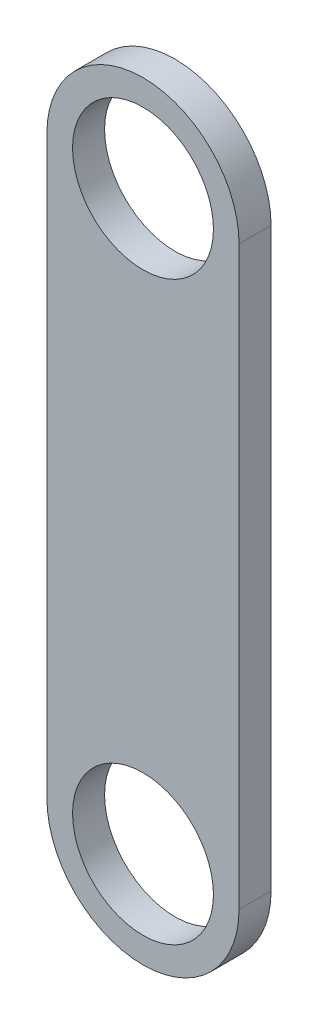
ISO-10303-21;
HEADER;
FILE_DESCRIPTION(('STEP AP214'),'2;1');
FILE_NAME('part.step','',(''),(''),'','','');
FILE_SCHEMA(('AUTOMOTIVE_DESIGN { 1 0 10303 214 1 1 1 1 }'));
ENDSEC;
DATA;
#1=APPLICATION_CONTEXT('core data for automotive mechanical design processes');
#2=APPLICATION_PROTOCOL_DEFINITION('international standard','automotive_design',2000,#1);
#3=PRODUCT_CONTEXT('',#1,'mechanical');
#4=PRODUCT('Part','Part','',(#3));
#5=PRODUCT_RELATED_PRODUCT_CATEGORY('part','',(#4));
#6=PRODUCT_DEFINITION_FORMATION('','',#4);
#7=PRODUCT_DEFINITION_CONTEXT('part definition',#1,'design');
#8=PRODUCT_DEFINITION('design','',#6,#7);
#9=PRODUCT_DEFINITION_SHAPE('','',#8);
#10=(LENGTH_UNIT() NAMED_UNIT(*) SI_UNIT(.MILLI.,.METRE.));
#11=(NAMED_UNIT(*) PLANE_ANGLE_UNIT() SI_UNIT($,.RADIAN.));
#12=(NAMED_UNIT(*) SI_UNIT($,.STERADIAN.) SOLID_ANGLE_UNIT());
#13=UNCERTAINTY_MEASURE_WITH_UNIT(LENGTH_MEASURE(1.E-05),#10,'distance_accuracy_value','');
#14=(GEOMETRIC_REPRESENTATION_CONTEXT(3) GLOBAL_UNCERTAINTY_ASSIGNED_CONTEXT((#13)) GLOBAL_UNIT_ASSIGNED_CONTEXT((#10,
#11,#12)) REPRESENTATION_CONTEXT('',''));
#15=CARTESIAN_POINT('',(0.,0.,0.));
#16=DIRECTION('',(0.,0.,1.));
#17=DIRECTION('',(1.,0.,0.));
#18=AXIS2_PLACEMENT_3D('',#15,#16,#17);
#19=CARTESIAN_POINT('',(0.,90.,72.));
#20=DIRECTION('',(0.,0.,1.));
#21=DIRECTION('',(1.,0.,0.));
#22=AXIS2_PLACEMENT_3D('',#19,#20,#21);
#23=PLANE('',#22);
#24=CARTESIAN_POINT('',(0.,0.,72.));
#25=DIRECTION('',(0.,0.,1.));
#26=DIRECTION('',(1.,0.,0.));
#27=AXIS2_PLACEMENT_3D('',#24,#25,#26);
#28=CIRCLE('',#27,11.);
#29=CARTESIAN_POINT('',(11.,0.,72.));
#30=VERTEX_POINT('',#29);
#31=EDGE_CURVE('E125',#30,#30,#28,.T.);
#32=ORIENTED_EDGE('',*,*,#31,.F.);
#33=EDGE_LOOP('',(#32));
#34=FACE_BOUND('',#33,.T.);
#35=CARTESIAN_POINT('',(0.,90.,72.));
#36=DIRECTION('',(0.,0.,1.));
#37=DIRECTION('',(1.,0.,0.));
#38=AXIS2_PLACEMENT_3D('',#35,#36,#37);
#39=CIRCLE('',#38,15.);
#40=CARTESIAN_POINT('',(15.,90.,72.));
#41=VERTEX_POINT('',#40);
#42=CARTESIAN_POINT('',(-15.,90.,72.));
#43=VERTEX_POINT('',#42);
#44=EDGE_CURVE('E118',#41,#43,#39,.T.);
#45=ORIENTED_EDGE('',*,*,#44,.T.);
#46=DIRECTION('',(0.,-1.,0.));
#47=VECTOR('',#46,1.);
#48=CARTESIAN_POINT('',(-15.,90.,72.));
#49=LINE('',#48,#47);
#50=CARTESIAN_POINT('',(-15.,0.,72.));
#51=VERTEX_POINT('',#50);
#52=EDGE_CURVE('E144',#43,#51,#49,.T.);
#53=ORIENTED_EDGE('',*,*,#52,.T.);
#54=CARTESIAN_POINT('',(0.,0.,72.));
#55=DIRECTION('',(0.,0.,1.));
#56=DIRECTION('',(1.,0.,0.));
#57=AXIS2_PLACEMENT_3D('',#54,#55,#56);
#58=CIRCLE('',#57,15.);
#59=CARTESIAN_POINT('',(15.,0.,72.));
#60=VERTEX_POINT('',#59);
#61=EDGE_CURVE('E142',#51,#60,#58,.T.);
#62=ORIENTED_EDGE('',*,*,#61,.T.);
#63=DIRECTION('',(0.,1.,0.));
#64=VECTOR('',#63,1.);
#65=CARTESIAN_POINT('',(15.,90.,72.));
#66=LINE('',#65,#64);
#67=EDGE_CURVE('E105',#60,#41,#66,.T.);
#68=ORIENTED_EDGE('',*,*,#67,.T.);
#69=EDGE_LOOP('',(#45,#53,#62,#68));
#70=FACE_BOUND('',#69,.T.);
#71=CARTESIAN_POINT('',(0.,90.,72.));
#72=DIRECTION('',(0.,0.,1.));
#73=DIRECTION('',(1.,0.,0.));
#74=AXIS2_PLACEMENT_3D('',#71,#72,#73);
#75=CIRCLE('',#74,11.);
#76=CARTESIAN_POINT('',(11.,90.,72.));
#77=VERTEX_POINT('',#76);
#78=EDGE_CURVE('E132',#77,#77,#75,.T.);
#79=ORIENTED_EDGE('',*,*,#78,.F.);
#80=EDGE_LOOP('',(#79));
#81=FACE_BOUND('',#80,.T.);
#82=ADVANCED_FACE('F59',(#34,#70,#81),#23,.T.);
#83=CARTESIAN_POINT('',(0.,0.,72.));
#84=DIRECTION('',(0.,0.,-1.));
#85=DIRECTION('',(-1.,0.,0.));
#86=AXIS2_PLACEMENT_3D('',#83,#84,#85);
#87=CYLINDRICAL_SURFACE('',#86,15.);
#88=CARTESIAN_POINT('',(0.,0.,67.));
#89=DIRECTION('',(0.,0.,-1.));
#90=DIRECTION('',(-1.,0.,0.));
#91=AXIS2_PLACEMENT_3D('',#88,#89,#90);
#92=CIRCLE('',#91,15.);
#93=CARTESIAN_POINT('',(15.,0.,67.));
#94=VERTEX_POINT('',#93);
#95=CARTESIAN_POINT('',(-15.,0.,67.));
#96=VERTEX_POINT('',#95);
#97=EDGE_CURVE('E68',#94,#96,#92,.T.);
#98=ORIENTED_EDGE('',*,*,#97,.F.);
#99=DIRECTION('',(0.,0.,-1.));
#100=VECTOR('',#99,1.);
#101=CARTESIAN_POINT('',(15.,0.,72.));
#102=LINE('',#101,#100);
#103=EDGE_CURVE('E114',#60,#94,#102,.T.);
#104=ORIENTED_EDGE('',*,*,#103,.F.);
#105=ORIENTED_EDGE('',*,*,#61,.F.);
#106=DIRECTION('',(0.,0.,-1.));
#107=VECTOR('',#106,1.);
#108=CARTESIAN_POINT('',(-15.,0.,72.));
#109=LINE('',#108,#107);
#110=EDGE_CURVE('E120',#51,#96,#109,.T.);
#111=ORIENTED_EDGE('',*,*,#110,.T.);
#112=EDGE_LOOP('',(#98,#104,#105,#111));
#113=FACE_BOUND('',#112,.T.);
#114=ADVANCED_FACE('F141',(#113),#87,.T.);
#115=CARTESIAN_POINT('',(0.,0.,72.));
#116=DIRECTION('',(0.,0.,-1.));
#117=DIRECTION('',(-1.,0.,0.));
#118=AXIS2_PLACEMENT_3D('',#115,#116,#117);
#119=CYLINDRICAL_SURFACE('',#118,11.);
#120=ORIENTED_EDGE('',*,*,#31,.T.);
#121=EDGE_LOOP('',(#120));
#122=FACE_BOUND('',#121,.T.);
#123=CARTESIAN_POINT('',(0.,0.,67.));
#124=DIRECTION('',(0.,0.,-1.));
#125=DIRECTION('',(-1.,0.,0.));
#126=AXIS2_PLACEMENT_3D('',#123,#124,#125);
#127=CIRCLE('',#126,11.);
#128=CARTESIAN_POINT('',(-11.,0.,67.));
#129=VERTEX_POINT('',#128);
#130=EDGE_CURVE('E127',#129,#129,#127,.T.);
#131=ORIENTED_EDGE('',*,*,#130,.T.);
#132=EDGE_LOOP('',(#131));
#133=FACE_BOUND('',#132,.T.);
#134=ADVANCED_FACE('F158',(#122,#133),#119,.F.);
#135=CARTESIAN_POINT('',(0.,90.,72.));
#136=DIRECTION('',(0.,0.,-1.));
#137=DIRECTION('',(-1.,0.,0.));
#138=AXIS2_PLACEMENT_3D('',#135,#136,#137);
#139=CYLINDRICAL_SURFACE('',#138,15.);
#140=CARTESIAN_POINT('',(0.,90.,67.));
#141=DIRECTION('',(0.,0.,-1.));
#142=DIRECTION('',(-1.,0.,0.));
#143=AXIS2_PLACEMENT_3D('',#140,#141,#142);
#144=CIRCLE('',#143,15.);
#145=CARTESIAN_POINT('',(-15.,90.,67.));
#146=VERTEX_POINT('',#145);
#147=CARTESIAN_POINT('',(15.,90.,67.));
#148=VERTEX_POINT('',#147);
#149=EDGE_CURVE('E96',#146,#148,#144,.T.);
#150=ORIENTED_EDGE('',*,*,#149,.F.);
#151=DIRECTION('',(0.,0.,-1.));
#152=VECTOR('',#151,1.);
#153=CARTESIAN_POINT('',(-15.,90.,72.));
#154=LINE('',#153,#152);
#155=EDGE_CURVE('E119',#43,#146,#154,.T.);
#156=ORIENTED_EDGE('',*,*,#155,.F.);
#157=ORIENTED_EDGE('',*,*,#44,.F.);
#158=DIRECTION('',(0.,0.,-1.));
#159=VECTOR('',#158,1.);
#160=CARTESIAN_POINT('',(15.,90.,72.));
#161=LINE('',#160,#159);
#162=EDGE_CURVE('E63',#41,#148,#161,.T.);
#163=ORIENTED_EDGE('',*,*,#162,.T.);
#164=EDGE_LOOP('',(#150,#156,#157,#163));
#165=FACE_BOUND('',#164,.T.);
#166=ADVANCED_FACE('F116',(#165),#139,.T.);
#167=CARTESIAN_POINT('',(0.,90.,72.));
#168=DIRECTION('',(0.,0.,-1.));
#169=DIRECTION('',(-1.,0.,0.));
#170=AXIS2_PLACEMENT_3D('',#167,#168,#169);
#171=CYLINDRICAL_SURFACE('',#170,11.);
#172=ORIENTED_EDGE('',*,*,#78,.T.);
#173=EDGE_LOOP('',(#172));
#174=FACE_BOUND('',#173,.T.);
#175=CARTESIAN_POINT('',(0.,90.,67.));
#176=DIRECTION('',(0.,0.,-1.));
#177=DIRECTION('',(-1.,0.,0.));
#178=AXIS2_PLACEMENT_3D('',#175,#176,#177);
#179=CIRCLE('',#178,11.);
#180=CARTESIAN_POINT('',(-11.,90.,67.));
#181=VERTEX_POINT('',#180);
#182=EDGE_CURVE('E137',#181,#181,#179,.T.);
#183=ORIENTED_EDGE('',*,*,#182,.T.);
#184=EDGE_LOOP('',(#183));
#185=FACE_BOUND('',#184,.T.);
#186=ADVANCED_FACE('F61',(#174,#185),#171,.F.);
#187=CARTESIAN_POINT('',(55.,115.,67.));
#188=DIRECTION('',(0.,0.,-1.));
#189=DIRECTION('',(-1.,0.,0.));
#190=AXIS2_PLACEMENT_3D('',#187,#188,#189);
#191=PLANE('',#190);
#192=ORIENTED_EDGE('',*,*,#97,.T.);
#193=DIRECTION('',(0.,-1.,0.));
#194=VECTOR('',#193,1.);
#195=CARTESIAN_POINT('',(-15.,115.,67.));
#196=LINE('',#195,#194);
#197=EDGE_CURVE('E12',#146,#96,#196,.T.);
#198=ORIENTED_EDGE('',*,*,#197,.F.);
#199=ORIENTED_EDGE('',*,*,#149,.T.);
#200=DIRECTION('',(0.,-1.,0.));
#201=VECTOR('',#200,1.);
#202=CARTESIAN_POINT('',(15.,90.,67.));
#203=LINE('',#202,#201);
#204=EDGE_CURVE('E100',#148,#94,#203,.T.);
#205=ORIENTED_EDGE('',*,*,#204,.T.);
#206=EDGE_LOOP('',(#192,#198,#199,#205));
#207=FACE_BOUND('',#206,.T.);
#208=ORIENTED_EDGE('',*,*,#182,.F.);
#209=EDGE_LOOP('',(#208));
#210=FACE_BOUND('',#209,.T.);
#211=ORIENTED_EDGE('',*,*,#130,.F.);
#212=EDGE_LOOP('',(#211));
#213=FACE_BOUND('',#212,.T.);
#214=ADVANCED_FACE('F98',(#207,#210,#213),#191,.T.);
#215=CARTESIAN_POINT('',(15.,90.,72.));
#216=DIRECTION('',(-1.,0.,0.));
#217=DIRECTION('',(0.,-1.,0.));
#218=AXIS2_PLACEMENT_3D('',#215,#216,#217);
#219=PLANE('',#218);
#220=ORIENTED_EDGE('',*,*,#204,.F.);
#221=ORIENTED_EDGE('',*,*,#162,.F.);
#222=ORIENTED_EDGE('',*,*,#67,.F.);
#223=ORIENTED_EDGE('',*,*,#103,.T.);
#224=EDGE_LOOP('',(#220,#221,#222,#223));
#225=FACE_BOUND('',#224,.T.);
#226=ADVANCED_FACE('F110',(#225),#219,.F.);
#227=CARTESIAN_POINT('',(-15.,90.,72.));
#228=DIRECTION('',(1.,0.,0.));
#229=DIRECTION('',(0.,1.,0.));
#230=AXIS2_PLACEMENT_3D('',#227,#228,#229);
#231=PLANE('',#230);
#232=ORIENTED_EDGE('',*,*,#155,.T.);
#233=ORIENTED_EDGE('',*,*,#197,.T.);
#234=ORIENTED_EDGE('',*,*,#110,.F.);
#235=ORIENTED_EDGE('',*,*,#52,.F.);
#236=EDGE_LOOP('',(#232,#233,#234,#235));
#237=FACE_BOUND('',#236,.T.);
#238=ADVANCED_FACE('F143',(#237),#231,.F.);
#239=CLOSED_SHELL('',(#82,#114,#134,#166,#186,#214,#226,#238));
#240=MANIFOLD_SOLID_BREP('B2',#239);
#241=ADVANCED_BREP_SHAPE_REPRESENTATION('',(#18,#240),#14);
#242=SHAPE_DEFINITION_REPRESENTATION(#9,#241);
ENDSEC;
END-ISO-10303-21;
